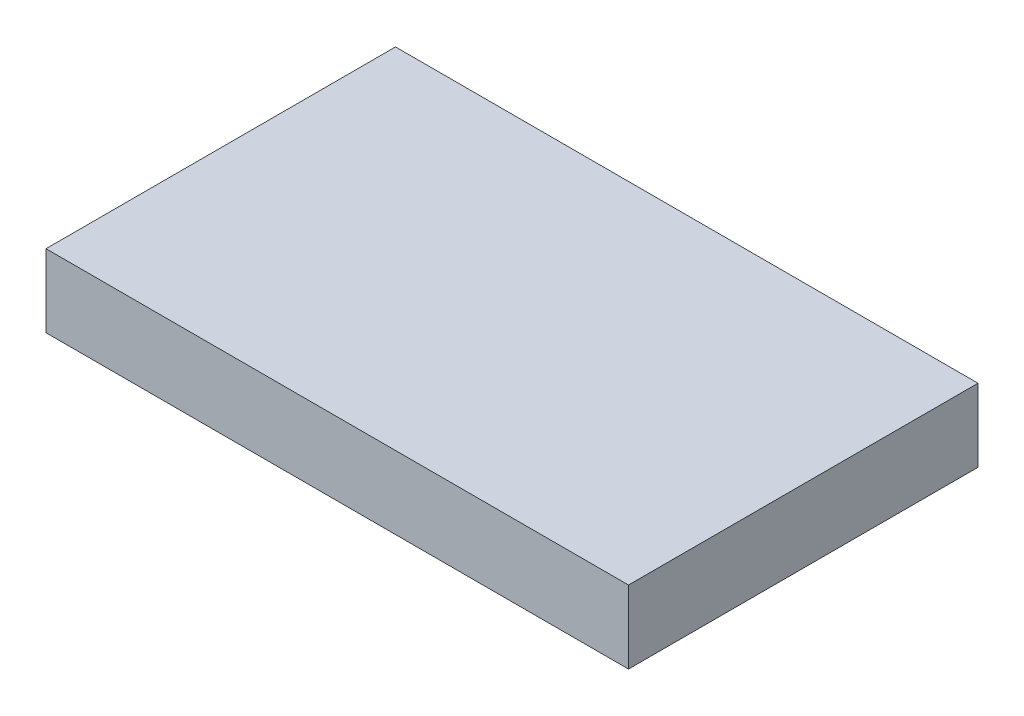
ISO-10303-21;
HEADER;
FILE_DESCRIPTION(('STEP AP214'),'2;1');
FILE_NAME('part.step','',(''),(''),'','','');
FILE_SCHEMA(('AUTOMOTIVE_DESIGN { 1 0 10303 214 1 1 1 1 }'));
ENDSEC;
DATA;
#1=APPLICATION_CONTEXT('core data for automotive mechanical design processes');
#2=APPLICATION_PROTOCOL_DEFINITION('international standard','automotive_design',2000,#1);
#3=PRODUCT_CONTEXT('',#1,'mechanical');
#4=PRODUCT('Part','Part','',(#3));
#5=PRODUCT_RELATED_PRODUCT_CATEGORY('part','',(#4));
#6=PRODUCT_DEFINITION_FORMATION('','',#4);
#7=PRODUCT_DEFINITION_CONTEXT('part definition',#1,'design');
#8=PRODUCT_DEFINITION('design','',#6,#7);
#9=PRODUCT_DEFINITION_SHAPE('','',#8);
#10=(LENGTH_UNIT() NAMED_UNIT(*) SI_UNIT(.MILLI.,.METRE.));
#11=(NAMED_UNIT(*) PLANE_ANGLE_UNIT() SI_UNIT($,.RADIAN.));
#12=(NAMED_UNIT(*) SI_UNIT($,.STERADIAN.) SOLID_ANGLE_UNIT());
#13=UNCERTAINTY_MEASURE_WITH_UNIT(LENGTH_MEASURE(1.E-05),#10,'distance_accuracy_value','');
#14=(GEOMETRIC_REPRESENTATION_CONTEXT(3) GLOBAL_UNCERTAINTY_ASSIGNED_CONTEXT((#13)) GLOBAL_UNIT_ASSIGNED_CONTEXT((#10,
#11,#12)) REPRESENTATION_CONTEXT('',''));
#15=CARTESIAN_POINT('',(0.,0.,0.));
#16=DIRECTION('',(0.,0.,1.));
#17=DIRECTION('',(1.,0.,0.));
#18=AXIS2_PLACEMENT_3D('',#15,#16,#17);
#19=CARTESIAN_POINT('',(-100.,-25.,60.));
#20=DIRECTION('',(-1.,0.,0.));
#21=DIRECTION('',(0.,0.,1.));
#22=AXIS2_PLACEMENT_3D('',#19,#20,#21);
#23=PLANE('',#22);
#24=DIRECTION('',(0.,0.,1.));
#25=VECTOR('',#24,1.);
#26=CARTESIAN_POINT('',(-100.,0.,60.));
#27=LINE('',#26,#25);
#28=CARTESIAN_POINT('',(-100.,0.,-60.));
#29=VERTEX_POINT('',#28);
#30=CARTESIAN_POINT('',(-100.,0.,60.));
#31=VERTEX_POINT('',#30);
#32=EDGE_CURVE('E103',#29,#31,#27,.T.);
#33=ORIENTED_EDGE('',*,*,#32,.F.);
#34=DIRECTION('',(0.,1.,0.));
#35=VECTOR('',#34,1.);
#36=CARTESIAN_POINT('',(-100.,-25.,-60.));
#37=LINE('',#36,#35);
#38=CARTESIAN_POINT('',(-100.,-25.,-60.));
#39=VERTEX_POINT('',#38);
#40=EDGE_CURVE('E11',#39,#29,#37,.T.);
#41=ORIENTED_EDGE('',*,*,#40,.F.);
#42=DIRECTION('',(0.,0.,1.));
#43=VECTOR('',#42,1.);
#44=CARTESIAN_POINT('',(-100.,-25.,60.));
#45=LINE('',#44,#43);
#46=CARTESIAN_POINT('',(-100.,-25.,60.));
#47=VERTEX_POINT('',#46);
#48=EDGE_CURVE('E100',#39,#47,#45,.T.);
#49=ORIENTED_EDGE('',*,*,#48,.T.);
#50=DIRECTION('',(0.,1.,0.));
#51=VECTOR('',#50,1.);
#52=CARTESIAN_POINT('',(-100.,-25.,60.));
#53=LINE('',#52,#51);
#54=EDGE_CURVE('E45',#47,#31,#53,.T.);
#55=ORIENTED_EDGE('',*,*,#54,.T.);
#56=EDGE_LOOP('',(#33,#41,#49,#55));
#57=FACE_BOUND('',#56,.T.);
#58=ADVANCED_FACE('F39',(#57),#23,.T.);
#59=CARTESIAN_POINT('',(-100.,-25.,-60.));
#60=DIRECTION('',(0.,0.,-1.));
#61=DIRECTION('',(-1.,0.,0.));
#62=AXIS2_PLACEMENT_3D('',#59,#60,#61);
#63=PLANE('',#62);
#64=DIRECTION('',(-1.,0.,0.));
#65=VECTOR('',#64,1.);
#66=CARTESIAN_POINT('',(-100.,0.,-60.));
#67=LINE('',#66,#65);
#68=CARTESIAN_POINT('',(100.,0.,-60.));
#69=VERTEX_POINT('',#68);
#70=EDGE_CURVE('E97',#69,#29,#67,.T.);
#71=ORIENTED_EDGE('',*,*,#70,.F.);
#72=DIRECTION('',(0.,1.,0.));
#73=VECTOR('',#72,1.);
#74=CARTESIAN_POINT('',(100.,-25.,-60.));
#75=LINE('',#74,#73);
#76=CARTESIAN_POINT('',(100.,-25.,-60.));
#77=VERTEX_POINT('',#76);
#78=EDGE_CURVE('E48',#77,#69,#75,.T.);
#79=ORIENTED_EDGE('',*,*,#78,.F.);
#80=DIRECTION('',(-1.,0.,0.));
#81=VECTOR('',#80,1.);
#82=CARTESIAN_POINT('',(-100.,-25.,-60.));
#83=LINE('',#82,#81);
#84=EDGE_CURVE('E94',#77,#39,#83,.T.);
#85=ORIENTED_EDGE('',*,*,#84,.T.);
#86=ORIENTED_EDGE('',*,*,#40,.T.);
#87=EDGE_LOOP('',(#71,#79,#85,#86));
#88=FACE_BOUND('',#87,.T.);
#89=ADVANCED_FACE('F114',(#88),#63,.T.);
#90=CARTESIAN_POINT('',(100.,-25.,60.));
#91=DIRECTION('',(1.,0.,0.));
#92=DIRECTION('',(0.,0.,-1.));
#93=AXIS2_PLACEMENT_3D('',#90,#91,#92);
#94=PLANE('',#93);
#95=DIRECTION('',(0.,0.,-1.));
#96=VECTOR('',#95,1.);
#97=CARTESIAN_POINT('',(100.,0.,60.));
#98=LINE('',#97,#96);
#99=CARTESIAN_POINT('',(100.,0.,60.));
#100=VERTEX_POINT('',#99);
#101=EDGE_CURVE('E90',#100,#69,#98,.T.);
#102=ORIENTED_EDGE('',*,*,#101,.F.);
#103=DIRECTION('',(0.,1.,0.));
#104=VECTOR('',#103,1.);
#105=CARTESIAN_POINT('',(100.,-25.,60.));
#106=LINE('',#105,#104);
#107=CARTESIAN_POINT('',(100.,-25.,60.));
#108=VERTEX_POINT('',#107);
#109=EDGE_CURVE('E81',#108,#100,#106,.T.);
#110=ORIENTED_EDGE('',*,*,#109,.F.);
#111=DIRECTION('',(0.,0.,-1.));
#112=VECTOR('',#111,1.);
#113=CARTESIAN_POINT('',(100.,-25.,60.));
#114=LINE('',#113,#112);
#115=EDGE_CURVE('E87',#108,#77,#114,.T.);
#116=ORIENTED_EDGE('',*,*,#115,.T.);
#117=ORIENTED_EDGE('',*,*,#78,.T.);
#118=EDGE_LOOP('',(#102,#110,#116,#117));
#119=FACE_BOUND('',#118,.T.);
#120=ADVANCED_FACE('F88',(#119),#94,.T.);
#121=CARTESIAN_POINT('',(-100.,-25.,60.));
#122=DIRECTION('',(0.,0.,1.));
#123=DIRECTION('',(1.,0.,0.));
#124=AXIS2_PLACEMENT_3D('',#121,#122,#123);
#125=PLANE('',#124);
#126=DIRECTION('',(1.,0.,0.));
#127=VECTOR('',#126,1.);
#128=CARTESIAN_POINT('',(-100.,0.,60.));
#129=LINE('',#128,#127);
#130=EDGE_CURVE('E106',#31,#100,#129,.T.);
#131=ORIENTED_EDGE('',*,*,#130,.F.);
#132=ORIENTED_EDGE('',*,*,#54,.F.);
#133=DIRECTION('',(1.,0.,0.));
#134=VECTOR('',#133,1.);
#135=CARTESIAN_POINT('',(-100.,-25.,60.));
#136=LINE('',#135,#134);
#137=EDGE_CURVE('E91',#47,#108,#136,.T.);
#138=ORIENTED_EDGE('',*,*,#137,.T.);
#139=ORIENTED_EDGE('',*,*,#109,.T.);
#140=EDGE_LOOP('',(#131,#132,#138,#139));
#141=FACE_BOUND('',#140,.T.);
#142=ADVANCED_FACE('F96',(#141),#125,.T.);
#143=CARTESIAN_POINT('',(0.,-25.,0.));
#144=DIRECTION('',(0.,-1.,0.));
#145=DIRECTION('',(0.,0.,-1.));
#146=AXIS2_PLACEMENT_3D('',#143,#144,#145);
#147=PLANE('',#146);
#148=ORIENTED_EDGE('',*,*,#48,.F.);
#149=ORIENTED_EDGE('',*,*,#84,.F.);
#150=ORIENTED_EDGE('',*,*,#115,.F.);
#151=ORIENTED_EDGE('',*,*,#137,.F.);
#152=EDGE_LOOP('',(#148,#149,#150,#151));
#153=FACE_BOUND('',#152,.T.);
#154=ADVANCED_FACE('F95',(#153),#147,.T.);
#155=CARTESIAN_POINT('',(0.,0.,0.));
#156=DIRECTION('',(0.,-1.,0.));
#157=DIRECTION('',(0.,0.,-1.));
#158=AXIS2_PLACEMENT_3D('',#155,#156,#157);
#159=PLANE('',#158);
#160=ORIENTED_EDGE('',*,*,#32,.T.);
#161=ORIENTED_EDGE('',*,*,#130,.T.);
#162=ORIENTED_EDGE('',*,*,#101,.T.);
#163=ORIENTED_EDGE('',*,*,#70,.T.);
#164=EDGE_LOOP('',(#160,#161,#162,#163));
#165=FACE_BOUND('',#164,.T.);
#166=ADVANCED_FACE('F115',(#165),#159,.F.);
#167=CLOSED_SHELL('',(#58,#89,#120,#142,#154,#166));
#168=MANIFOLD_SOLID_BREP('B2',#167);
#169=ADVANCED_BREP_SHAPE_REPRESENTATION('',(#18,#168),#14);
#170=SHAPE_DEFINITION_REPRESENTATION(#9,#169);
ENDSEC;
END-ISO-10303-21;
